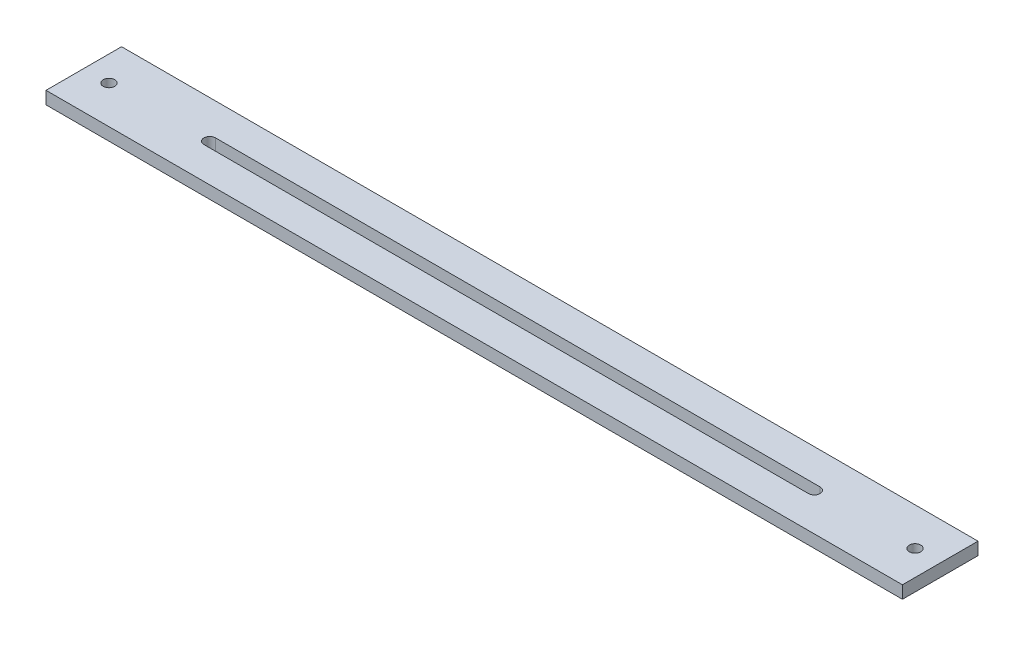
ISO-10303-21;
HEADER;
FILE_DESCRIPTION(('STEP AP214'),'2;1');
FILE_NAME('part.step','',(''),(''),'','','');
FILE_SCHEMA(('AUTOMOTIVE_DESIGN { 1 0 10303 214 1 1 1 1 }'));
ENDSEC;
DATA;
#1=APPLICATION_CONTEXT('core data for automotive mechanical design processes');
#2=APPLICATION_PROTOCOL_DEFINITION('international standard','automotive_design',2000,#1);
#3=PRODUCT_CONTEXT('',#1,'mechanical');
#4=PRODUCT('Part','Part','',(#3));
#5=PRODUCT_RELATED_PRODUCT_CATEGORY('part','',(#4));
#6=PRODUCT_DEFINITION_FORMATION('','',#4);
#7=PRODUCT_DEFINITION_CONTEXT('part definition',#1,'design');
#8=PRODUCT_DEFINITION('design','',#6,#7);
#9=PRODUCT_DEFINITION_SHAPE('','',#8);
#10=(LENGTH_UNIT() NAMED_UNIT(*) SI_UNIT(.MILLI.,.METRE.));
#11=(NAMED_UNIT(*) PLANE_ANGLE_UNIT() SI_UNIT($,.RADIAN.));
#12=(NAMED_UNIT(*) SI_UNIT($,.STERADIAN.) SOLID_ANGLE_UNIT());
#13=UNCERTAINTY_MEASURE_WITH_UNIT(LENGTH_MEASURE(1.E-05),#10,'distance_accuracy_value','');
#14=(GEOMETRIC_REPRESENTATION_CONTEXT(3) GLOBAL_UNCERTAINTY_ASSIGNED_CONTEXT((#13)) GLOBAL_UNIT_ASSIGNED_CONTEXT((#10,
#11,#12)) REPRESENTATION_CONTEXT('',''));
#15=CARTESIAN_POINT('',(0.,0.,0.));
#16=DIRECTION('',(0.,0.,1.));
#17=DIRECTION('',(1.,0.,0.));
#18=AXIS2_PLACEMENT_3D('',#15,#16,#17);
#19=CARTESIAN_POINT('',(0.,3.175,0.));
#20=DIRECTION('',(1.,0.,0.));
#21=DIRECTION('',(0.,0.,-1.));
#22=AXIS2_PLACEMENT_3D('',#19,#20,#21);
#23=PLANE('',#22);
#24=DIRECTION('',(0.,0.,1.));
#25=VECTOR('',#24,1.);
#26=CARTESIAN_POINT('',(0.,0.,0.));
#27=LINE('',#26,#25);
#28=CARTESIAN_POINT('',(0.,0.,-19.05));
#29=VERTEX_POINT('',#28);
#30=CARTESIAN_POINT('',(0.,0.,0.));
#31=VERTEX_POINT('',#30);
#32=EDGE_CURVE('E163',#29,#31,#27,.T.);
#33=ORIENTED_EDGE('',*,*,#32,.T.);
#34=DIRECTION('',(0.,-1.,0.));
#35=VECTOR('',#34,1.);
#36=CARTESIAN_POINT('',(0.,3.175,0.));
#37=LINE('',#36,#35);
#38=CARTESIAN_POINT('',(0.,3.175,0.));
#39=VERTEX_POINT('',#38);
#40=EDGE_CURVE('E12',#39,#31,#37,.T.);
#41=ORIENTED_EDGE('',*,*,#40,.F.);
#42=DIRECTION('',(0.,0.,1.));
#43=VECTOR('',#42,1.);
#44=CARTESIAN_POINT('',(0.,3.175,0.));
#45=LINE('',#44,#43);
#46=CARTESIAN_POINT('',(0.,3.175,-19.05));
#47=VERTEX_POINT('',#46);
#48=EDGE_CURVE('E152',#47,#39,#45,.T.);
#49=ORIENTED_EDGE('',*,*,#48,.F.);
#50=DIRECTION('',(0.,-1.,0.));
#51=VECTOR('',#50,1.);
#52=CARTESIAN_POINT('',(0.,3.175,-19.05));
#53=LINE('',#52,#51);
#54=EDGE_CURVE('E162',#47,#29,#53,.T.);
#55=ORIENTED_EDGE('',*,*,#54,.T.);
#56=EDGE_LOOP('',(#33,#41,#49,#55));
#57=FACE_BOUND('',#56,.T.);
#58=ADVANCED_FACE('F56',(#57),#23,.F.);
#59=CARTESIAN_POINT('',(0.,3.175,0.));
#60=DIRECTION('',(0.,0.,-1.));
#61=DIRECTION('',(-1.,0.,0.));
#62=AXIS2_PLACEMENT_3D('',#59,#60,#61);
#63=PLANE('',#62);
#64=DIRECTION('',(1.,0.,0.));
#65=VECTOR('',#64,1.);
#66=CARTESIAN_POINT('',(0.,0.,0.));
#67=LINE('',#66,#65);
#68=CARTESIAN_POINT('',(215.9,0.,0.));
#69=VERTEX_POINT('',#68);
#70=EDGE_CURVE('E166',#31,#69,#67,.T.);
#71=ORIENTED_EDGE('',*,*,#70,.T.);
#72=DIRECTION('',(0.,-1.,0.));
#73=VECTOR('',#72,1.);
#74=CARTESIAN_POINT('',(215.9,3.175,0.));
#75=LINE('',#74,#73);
#76=CARTESIAN_POINT('',(215.9,3.175,0.));
#77=VERTEX_POINT('',#76);
#78=EDGE_CURVE('E63',#77,#69,#75,.T.);
#79=ORIENTED_EDGE('',*,*,#78,.F.);
#80=DIRECTION('',(1.,0.,0.));
#81=VECTOR('',#80,1.);
#82=CARTESIAN_POINT('',(0.,3.175,0.));
#83=LINE('',#82,#81);
#84=EDGE_CURVE('E155',#39,#77,#83,.T.);
#85=ORIENTED_EDGE('',*,*,#84,.F.);
#86=ORIENTED_EDGE('',*,*,#40,.T.);
#87=EDGE_LOOP('',(#71,#79,#85,#86));
#88=FACE_BOUND('',#87,.T.);
#89=ADVANCED_FACE('F195',(#88),#63,.F.);
#90=CARTESIAN_POINT('',(215.9,3.175,0.));
#91=DIRECTION('',(-1.,0.,0.));
#92=DIRECTION('',(0.,0.,1.));
#93=AXIS2_PLACEMENT_3D('',#90,#91,#92);
#94=PLANE('',#93);
#95=DIRECTION('',(0.,0.,-1.));
#96=VECTOR('',#95,1.);
#97=CARTESIAN_POINT('',(215.9,0.,0.));
#98=LINE('',#97,#96);
#99=CARTESIAN_POINT('',(215.9,0.,-19.05));
#100=VERTEX_POINT('',#99);
#101=EDGE_CURVE('E169',#69,#100,#98,.T.);
#102=ORIENTED_EDGE('',*,*,#101,.T.);
#103=DIRECTION('',(0.,-1.,0.));
#104=VECTOR('',#103,1.);
#105=CARTESIAN_POINT('',(215.9,3.175,-19.05));
#106=LINE('',#105,#104);
#107=CARTESIAN_POINT('',(215.9,3.175,-19.05));
#108=VERTEX_POINT('',#107);
#109=EDGE_CURVE('E174',#108,#100,#106,.T.);
#110=ORIENTED_EDGE('',*,*,#109,.F.);
#111=DIRECTION('',(0.,0.,-1.));
#112=VECTOR('',#111,1.);
#113=CARTESIAN_POINT('',(215.9,3.175,0.));
#114=LINE('',#113,#112);
#115=EDGE_CURVE('E158',#77,#108,#114,.T.);
#116=ORIENTED_EDGE('',*,*,#115,.F.);
#117=ORIENTED_EDGE('',*,*,#78,.T.);
#118=EDGE_LOOP('',(#102,#110,#116,#117));
#119=FACE_BOUND('',#118,.T.);
#120=ADVANCED_FACE('F181',(#119),#94,.F.);
#121=CARTESIAN_POINT('',(0.,3.175,-19.05));
#122=DIRECTION('',(0.,0.,1.));
#123=DIRECTION('',(1.,0.,0.));
#124=AXIS2_PLACEMENT_3D('',#121,#122,#123);
#125=PLANE('',#124);
#126=DIRECTION('',(-1.,0.,0.));
#127=VECTOR('',#126,1.);
#128=CARTESIAN_POINT('',(0.,0.,-19.05));
#129=LINE('',#128,#127);
#130=EDGE_CURVE('E156',#100,#29,#129,.T.);
#131=ORIENTED_EDGE('',*,*,#130,.T.);
#132=ORIENTED_EDGE('',*,*,#54,.F.);
#133=DIRECTION('',(-1.,0.,0.));
#134=VECTOR('',#133,1.);
#135=CARTESIAN_POINT('',(0.,3.175,-19.05));
#136=LINE('',#135,#134);
#137=EDGE_CURVE('E160',#108,#47,#136,.T.);
#138=ORIENTED_EDGE('',*,*,#137,.F.);
#139=ORIENTED_EDGE('',*,*,#109,.T.);
#140=EDGE_LOOP('',(#131,#132,#138,#139));
#141=FACE_BOUND('',#140,.T.);
#142=ADVANCED_FACE('F190',(#141),#125,.F.);
#143=CARTESIAN_POINT('',(0.,3.175,0.));
#144=DIRECTION('',(0.,-1.,0.));
#145=DIRECTION('',(0.,0.,-1.));
#146=AXIS2_PLACEMENT_3D('',#143,#144,#145);
#147=PLANE('',#146);
#148=CARTESIAN_POINT('',(6.35,3.175,-9.525));
#149=DIRECTION('',(0.,1.,0.));
#150=DIRECTION('',(0.,0.,1.));
#151=AXIS2_PLACEMENT_3D('',#148,#149,#150);
#152=CIRCLE('',#151,1.4605);
#153=CARTESIAN_POINT('',(6.35,3.175,-8.0645));
#154=VERTEX_POINT('',#153);
#155=EDGE_CURVE('E236',#154,#154,#152,.T.);
#156=ORIENTED_EDGE('',*,*,#155,.F.);
#157=EDGE_LOOP('',(#156));
#158=FACE_BOUND('',#157,.T.);
#159=CARTESIAN_POINT('',(209.55,3.175,-9.525));
#160=DIRECTION('',(0.,1.,0.));
#161=DIRECTION('',(0.,0.,1.));
#162=AXIS2_PLACEMENT_3D('',#159,#160,#161);
#163=CIRCLE('',#162,1.4605);
#164=CARTESIAN_POINT('',(209.55,3.175,-8.0645));
#165=VERTEX_POINT('',#164);
#166=EDGE_CURVE('E237',#165,#165,#163,.T.);
#167=ORIENTED_EDGE('',*,*,#166,.F.);
#168=EDGE_LOOP('',(#167));
#169=FACE_BOUND('',#168,.T.);
#170=DIRECTION('',(1.,0.,0.));
#171=VECTOR('',#170,1.);
#172=CARTESIAN_POINT('',(0.,3.175,-10.9855));
#173=LINE('',#172,#171);
#174=CARTESIAN_POINT('',(31.75,3.175,-10.9855));
#175=VERTEX_POINT('',#174);
#176=CARTESIAN_POINT('',(184.15,3.175,-10.9855));
#177=VERTEX_POINT('',#176);
#178=EDGE_CURVE('E70',#175,#177,#173,.T.);
#179=ORIENTED_EDGE('',*,*,#178,.T.);
#180=CARTESIAN_POINT('',(184.15,3.175,-9.525));
#181=DIRECTION('',(0.,1.,0.));
#182=DIRECTION('',(0.,0.,1.));
#183=AXIS2_PLACEMENT_3D('',#180,#181,#182);
#184=CIRCLE('',#183,1.4605);
#185=CARTESIAN_POINT('',(184.15,3.175,-8.0645));
#186=VERTEX_POINT('',#185);
#187=EDGE_CURVE('E139',#186,#177,#184,.T.);
#188=ORIENTED_EDGE('',*,*,#187,.F.);
#189=DIRECTION('',(1.,0.,0.));
#190=VECTOR('',#189,1.);
#191=CARTESIAN_POINT('',(0.,3.175,-8.0645));
#192=LINE('',#191,#190);
#193=CARTESIAN_POINT('',(31.75,3.175,-8.0645));
#194=VERTEX_POINT('',#193);
#195=EDGE_CURVE('E122',#194,#186,#192,.T.);
#196=ORIENTED_EDGE('',*,*,#195,.F.);
#197=CARTESIAN_POINT('',(31.75,3.175,-9.525));
#198=DIRECTION('',(0.,1.,0.));
#199=DIRECTION('',(0.,0.,1.));
#200=AXIS2_PLACEMENT_3D('',#197,#198,#199);
#201=CIRCLE('',#200,1.4605);
#202=EDGE_CURVE('E130',#175,#194,#201,.T.);
#203=ORIENTED_EDGE('',*,*,#202,.F.);
#204=EDGE_LOOP('',(#179,#188,#196,#203));
#205=FACE_BOUND('',#204,.T.);
#206=ORIENTED_EDGE('',*,*,#48,.T.);
#207=ORIENTED_EDGE('',*,*,#84,.T.);
#208=ORIENTED_EDGE('',*,*,#115,.T.);
#209=ORIENTED_EDGE('',*,*,#137,.T.);
#210=EDGE_LOOP('',(#206,#207,#208,#209));
#211=FACE_BOUND('',#210,.T.);
#212=ADVANCED_FACE('F136',(#158,#169,#205,#211),#147,.F.);
#213=CARTESIAN_POINT('',(0.,0.,0.));
#214=DIRECTION('',(0.,-1.,0.));
#215=DIRECTION('',(0.,0.,-1.));
#216=AXIS2_PLACEMENT_3D('',#213,#214,#215);
#217=PLANE('',#216);
#218=CARTESIAN_POINT('',(6.35,0.,-9.525));
#219=DIRECTION('',(0.,1.,0.));
#220=DIRECTION('',(0.,0.,1.));
#221=AXIS2_PLACEMENT_3D('',#218,#219,#220);
#222=CIRCLE('',#221,1.4605);
#223=CARTESIAN_POINT('',(6.35,0.,-8.0645));
#224=VERTEX_POINT('',#223);
#225=EDGE_CURVE('E167',#224,#224,#222,.T.);
#226=ORIENTED_EDGE('',*,*,#225,.T.);
#227=EDGE_LOOP('',(#226));
#228=FACE_BOUND('',#227,.T.);
#229=CARTESIAN_POINT('',(209.55,0.,-9.525));
#230=DIRECTION('',(0.,1.,0.));
#231=DIRECTION('',(0.,0.,1.));
#232=AXIS2_PLACEMENT_3D('',#229,#230,#231);
#233=CIRCLE('',#232,1.4605);
#234=CARTESIAN_POINT('',(209.55,0.,-8.0645));
#235=VERTEX_POINT('',#234);
#236=EDGE_CURVE('E133',#235,#235,#233,.T.);
#237=ORIENTED_EDGE('',*,*,#236,.T.);
#238=EDGE_LOOP('',(#237));
#239=FACE_BOUND('',#238,.T.);
#240=CARTESIAN_POINT('',(184.15,0.,-9.525));
#241=DIRECTION('',(0.,1.,0.));
#242=DIRECTION('',(0.,0.,1.));
#243=AXIS2_PLACEMENT_3D('',#240,#241,#242);
#244=CIRCLE('',#243,1.4605);
#245=CARTESIAN_POINT('',(184.15,0.,-8.0645));
#246=VERTEX_POINT('',#245);
#247=CARTESIAN_POINT('',(184.15,0.,-10.9855));
#248=VERTEX_POINT('',#247);
#249=EDGE_CURVE('E147',#246,#248,#244,.T.);
#250=ORIENTED_EDGE('',*,*,#249,.T.);
#251=DIRECTION('',(1.,0.,0.));
#252=VECTOR('',#251,1.);
#253=CARTESIAN_POINT('',(0.,0.,-10.9855));
#254=LINE('',#253,#252);
#255=CARTESIAN_POINT('',(31.75,0.,-10.9855));
#256=VERTEX_POINT('',#255);
#257=EDGE_CURVE('E145',#256,#248,#254,.T.);
#258=ORIENTED_EDGE('',*,*,#257,.F.);
#259=CARTESIAN_POINT('',(31.75,0.,-9.525));
#260=DIRECTION('',(0.,1.,0.));
#261=DIRECTION('',(0.,0.,1.));
#262=AXIS2_PLACEMENT_3D('',#259,#260,#261);
#263=CIRCLE('',#262,1.4605);
#264=CARTESIAN_POINT('',(31.75,0.,-8.0645));
#265=VERTEX_POINT('',#264);
#266=EDGE_CURVE('E134',#256,#265,#263,.T.);
#267=ORIENTED_EDGE('',*,*,#266,.T.);
#268=DIRECTION('',(1.,0.,0.));
#269=VECTOR('',#268,1.);
#270=CARTESIAN_POINT('',(0.,0.,-8.0645));
#271=LINE('',#270,#269);
#272=EDGE_CURVE('E78',#265,#246,#271,.T.);
#273=ORIENTED_EDGE('',*,*,#272,.T.);
#274=EDGE_LOOP('',(#250,#258,#267,#273));
#275=FACE_BOUND('',#274,.T.);
#276=ORIENTED_EDGE('',*,*,#32,.F.);
#277=ORIENTED_EDGE('',*,*,#130,.F.);
#278=ORIENTED_EDGE('',*,*,#101,.F.);
#279=ORIENTED_EDGE('',*,*,#70,.F.);
#280=EDGE_LOOP('',(#276,#277,#278,#279));
#281=FACE_BOUND('',#280,.T.);
#282=ADVANCED_FACE('F187',(#228,#239,#275,#281),#217,.T.);
#283=CARTESIAN_POINT('',(0.,0.,-8.0645));
#284=DIRECTION('',(0.,0.,1.));
#285=DIRECTION('',(1.,0.,0.));
#286=AXIS2_PLACEMENT_3D('',#283,#284,#285);
#287=PLANE('',#286);
#288=ORIENTED_EDGE('',*,*,#195,.T.);
#289=DIRECTION('',(0.,1.,0.));
#290=VECTOR('',#289,1.);
#291=CARTESIAN_POINT('',(184.15,0.,-8.0645));
#292=LINE('',#291,#290);
#293=EDGE_CURVE('E148',#246,#186,#292,.T.);
#294=ORIENTED_EDGE('',*,*,#293,.F.);
#295=ORIENTED_EDGE('',*,*,#272,.F.);
#296=DIRECTION('',(0.,1.,0.));
#297=VECTOR('',#296,1.);
#298=CARTESIAN_POINT('',(31.75,0.,-8.0645));
#299=LINE('',#298,#297);
#300=EDGE_CURVE('E118',#265,#194,#299,.T.);
#301=ORIENTED_EDGE('',*,*,#300,.T.);
#302=EDGE_LOOP('',(#288,#294,#295,#301));
#303=FACE_BOUND('',#302,.T.);
#304=ADVANCED_FACE('F120',(#303),#287,.F.);
#305=CARTESIAN_POINT('',(0.,0.,-10.9855));
#306=DIRECTION('',(0.,0.,1.));
#307=DIRECTION('',(1.,0.,0.));
#308=AXIS2_PLACEMENT_3D('',#305,#306,#307);
#309=PLANE('',#308);
#310=ORIENTED_EDGE('',*,*,#178,.F.);
#311=DIRECTION('',(0.,1.,0.));
#312=VECTOR('',#311,1.);
#313=CARTESIAN_POINT('',(31.75,0.,-10.9855));
#314=LINE('',#313,#312);
#315=EDGE_CURVE('E127',#256,#175,#314,.T.);
#316=ORIENTED_EDGE('',*,*,#315,.F.);
#317=ORIENTED_EDGE('',*,*,#257,.T.);
#318=DIRECTION('',(0.,1.,0.));
#319=VECTOR('',#318,1.);
#320=CARTESIAN_POINT('',(184.15,0.,-10.9855));
#321=LINE('',#320,#319);
#322=EDGE_CURVE('E246',#248,#177,#321,.T.);
#323=ORIENTED_EDGE('',*,*,#322,.T.);
#324=EDGE_LOOP('',(#310,#316,#317,#323));
#325=FACE_BOUND('',#324,.T.);
#326=ADVANCED_FACE('F211',(#325),#309,.T.);
#327=CARTESIAN_POINT('',(184.15,0.,-9.525));
#328=DIRECTION('',(0.,1.,0.));
#329=DIRECTION('',(0.,0.,1.));
#330=AXIS2_PLACEMENT_3D('',#327,#328,#329);
#331=CYLINDRICAL_SURFACE('',#330,1.4605);
#332=ORIENTED_EDGE('',*,*,#187,.T.);
#333=ORIENTED_EDGE('',*,*,#322,.F.);
#334=ORIENTED_EDGE('',*,*,#249,.F.);
#335=ORIENTED_EDGE('',*,*,#293,.T.);
#336=EDGE_LOOP('',(#332,#333,#334,#335));
#337=FACE_BOUND('',#336,.T.);
#338=ADVANCED_FACE('F214',(#337),#331,.F.);
#339=CARTESIAN_POINT('',(31.75,0.,-9.525));
#340=DIRECTION('',(0.,1.,0.));
#341=DIRECTION('',(0.,0.,1.));
#342=AXIS2_PLACEMENT_3D('',#339,#340,#341);
#343=CYLINDRICAL_SURFACE('',#342,1.4605);
#344=ORIENTED_EDGE('',*,*,#266,.F.);
#345=ORIENTED_EDGE('',*,*,#315,.T.);
#346=ORIENTED_EDGE('',*,*,#202,.T.);
#347=ORIENTED_EDGE('',*,*,#300,.F.);
#348=EDGE_LOOP('',(#344,#345,#346,#347));
#349=FACE_BOUND('',#348,.T.);
#350=ADVANCED_FACE('F131',(#349),#343,.F.);
#351=CARTESIAN_POINT('',(209.55,0.,-9.525));
#352=DIRECTION('',(0.,1.,0.));
#353=DIRECTION('',(0.,0.,1.));
#354=AXIS2_PLACEMENT_3D('',#351,#352,#353);
#355=CYLINDRICAL_SURFACE('',#354,1.4605);
#356=ORIENTED_EDGE('',*,*,#236,.F.);
#357=EDGE_LOOP('',(#356));
#358=FACE_BOUND('',#357,.T.);
#359=ORIENTED_EDGE('',*,*,#166,.T.);
#360=EDGE_LOOP('',(#359));
#361=FACE_BOUND('',#360,.T.);
#362=ADVANCED_FACE('F218',(#358,#361),#355,.F.);
#363=CARTESIAN_POINT('',(6.35,0.,-9.525));
#364=DIRECTION('',(0.,1.,0.));
#365=DIRECTION('',(0.,0.,1.));
#366=AXIS2_PLACEMENT_3D('',#363,#364,#365);
#367=CYLINDRICAL_SURFACE('',#366,1.4605);
#368=ORIENTED_EDGE('',*,*,#225,.F.);
#369=EDGE_LOOP('',(#368));
#370=FACE_BOUND('',#369,.T.);
#371=ORIENTED_EDGE('',*,*,#155,.T.);
#372=EDGE_LOOP('',(#371));
#373=FACE_BOUND('',#372,.T.);
#374=ADVANCED_FACE('F225',(#370,#373),#367,.F.);
#375=CLOSED_SHELL('',(#58,#89,#120,#142,#212,#282,#304,#326,#338,#350,#362,#374));
#376=MANIFOLD_SOLID_BREP('B2',#375);
#377=ADVANCED_BREP_SHAPE_REPRESENTATION('',(#18,#376),#14);
#378=SHAPE_DEFINITION_REPRESENTATION(#9,#377);
ENDSEC;
END-ISO-10303-21;
